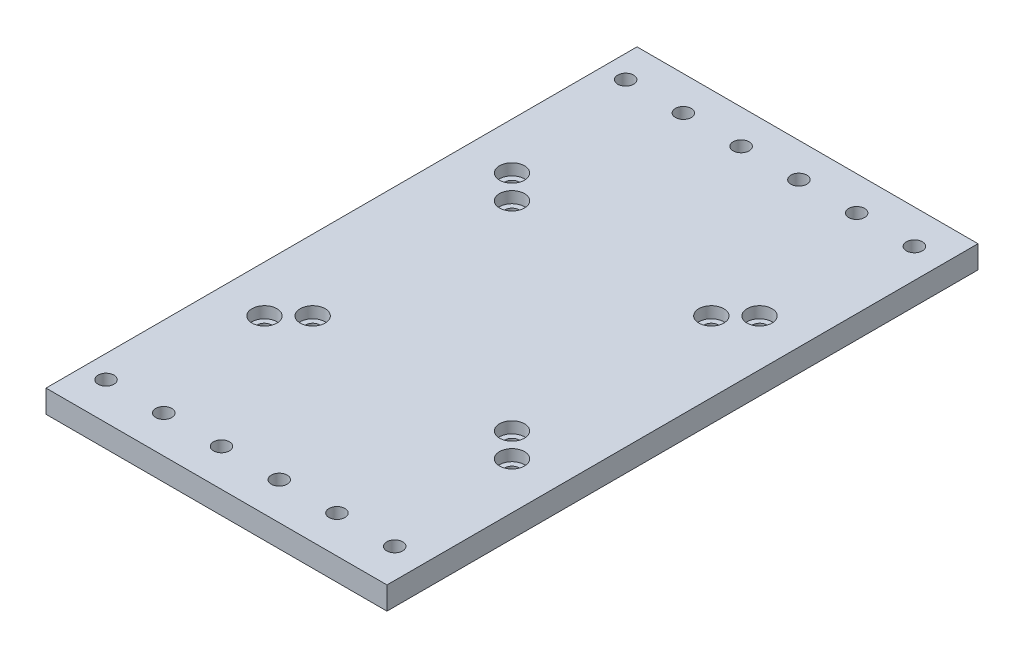
ISO-10303-21;
HEADER;
FILE_DESCRIPTION(('STEP AP214'),'2;1');
FILE_NAME('part.step','',(''),(''),'','','');
FILE_SCHEMA(('AUTOMOTIVE_DESIGN { 1 0 10303 214 1 1 1 1 }'));
ENDSEC;
DATA;
#1=APPLICATION_CONTEXT('core data for automotive mechanical design processes');
#2=APPLICATION_PROTOCOL_DEFINITION('international standard','automotive_design',2000,#1);
#3=PRODUCT_CONTEXT('',#1,'mechanical');
#4=PRODUCT('Part','Part','',(#3));
#5=PRODUCT_RELATED_PRODUCT_CATEGORY('part','',(#4));
#6=PRODUCT_DEFINITION_FORMATION('','',#4);
#7=PRODUCT_DEFINITION_CONTEXT('part definition',#1,'design');
#8=PRODUCT_DEFINITION('design','',#6,#7);
#9=PRODUCT_DEFINITION_SHAPE('','',#8);
#10=(LENGTH_UNIT() NAMED_UNIT(*) SI_UNIT(.MILLI.,.METRE.));
#11=(NAMED_UNIT(*) PLANE_ANGLE_UNIT() SI_UNIT($,.RADIAN.));
#12=(NAMED_UNIT(*) SI_UNIT($,.STERADIAN.) SOLID_ANGLE_UNIT());
#13=UNCERTAINTY_MEASURE_WITH_UNIT(LENGTH_MEASURE(1.E-05),#10,'distance_accuracy_value','');
#14=(GEOMETRIC_REPRESENTATION_CONTEXT(3) GLOBAL_UNCERTAINTY_ASSIGNED_CONTEXT((#13)) GLOBAL_UNIT_ASSIGNED_CONTEXT((#10,
#11,#12)) REPRESENTATION_CONTEXT('',''));
#15=CARTESIAN_POINT('',(0.,0.,0.));
#16=DIRECTION('',(0.,0.,1.));
#17=DIRECTION('',(1.,0.,0.));
#18=AXIS2_PLACEMENT_3D('',#15,#16,#17);
#19=CARTESIAN_POINT('',(-54.4472221513641,0.,54.4472221513643));
#20=DIRECTION('',(0.,1.,0.));
#21=DIRECTION('',(0.,0.,1.));
#22=AXIS2_PLACEMENT_3D('',#19,#20,#21);
#23=CYLINDRICAL_SURFACE('',#22,3.12499999999999);
#24=CARTESIAN_POINT('',(-54.4472221513641,0.,54.4472221513643));
#25=DIRECTION('',(0.,1.,0.));
#26=DIRECTION('',(0.,0.,1.));
#27=AXIS2_PLACEMENT_3D('',#24,#25,#26);
#28=CIRCLE('',#27,3.12499999999999);
#29=CARTESIAN_POINT('',(-54.4472221513641,0.,57.5722221513642));
#30=VERTEX_POINT('',#29);
#31=EDGE_CURVE('E103',#30,#30,#28,.T.);
#32=ORIENTED_EDGE('',*,*,#31,.F.);
#33=EDGE_LOOP('',(#32));
#34=FACE_BOUND('',#33,.T.);
#35=CARTESIAN_POINT('',(-54.4472221513641,5.,54.4472221513643));
#36=DIRECTION('',(0.,1.,0.));
#37=DIRECTION('',(0.,0.,1.));
#38=AXIS2_PLACEMENT_3D('',#35,#36,#37);
#39=CIRCLE('',#38,3.12499999999999);
#40=CARTESIAN_POINT('',(-54.4472221513641,5.,57.5722221513642));
#41=VERTEX_POINT('',#40);
#42=EDGE_CURVE('E131',#41,#41,#39,.F.);
#43=ORIENTED_EDGE('',*,*,#42,.F.);
#44=EDGE_LOOP('',(#43));
#45=FACE_BOUND('',#44,.T.);
#46=ADVANCED_FACE('F33',(#34,#45),#23,.F.);
#47=CARTESIAN_POINT('',(54.4472221513643,0.,54.447222151364));
#48=DIRECTION('',(0.,1.,0.));
#49=DIRECTION('',(0.,0.,1.));
#50=AXIS2_PLACEMENT_3D('',#47,#48,#49);
#51=CYLINDRICAL_SURFACE('',#50,3.125);
#52=CARTESIAN_POINT('',(54.4472221513643,0.,54.447222151364));
#53=DIRECTION('',(0.,1.,0.));
#54=DIRECTION('',(0.,0.,1.));
#55=AXIS2_PLACEMENT_3D('',#52,#53,#54);
#56=CIRCLE('',#55,3.125);
#57=CARTESIAN_POINT('',(54.4472221513643,0.,57.572222151364));
#58=VERTEX_POINT('',#57);
#59=EDGE_CURVE('E156',#58,#58,#56,.T.);
#60=ORIENTED_EDGE('',*,*,#59,.F.);
#61=EDGE_LOOP('',(#60));
#62=FACE_BOUND('',#61,.T.);
#63=CARTESIAN_POINT('',(54.4472221513643,5.,54.447222151364));
#64=DIRECTION('',(0.,1.,0.));
#65=DIRECTION('',(0.,0.,1.));
#66=AXIS2_PLACEMENT_3D('',#63,#64,#65);
#67=CIRCLE('',#66,3.125);
#68=CARTESIAN_POINT('',(54.4472221513643,5.,57.572222151364));
#69=VERTEX_POINT('',#68);
#70=EDGE_CURVE('E128',#69,#69,#67,.F.);
#71=ORIENTED_EDGE('',*,*,#70,.F.);
#72=EDGE_LOOP('',(#71));
#73=FACE_BOUND('',#72,.T.);
#74=ADVANCED_FACE('F189',(#62,#73),#51,.F.);
#75=CARTESIAN_POINT('',(43.840620433566,0.,43.8406204335658));
#76=DIRECTION('',(0.,1.,0.));
#77=DIRECTION('',(0.,0.,1.));
#78=AXIS2_PLACEMENT_3D('',#75,#76,#77);
#79=CYLINDRICAL_SURFACE('',#78,3.125);
#80=CARTESIAN_POINT('',(43.840620433566,0.,43.8406204335658));
#81=DIRECTION('',(0.,1.,0.));
#82=DIRECTION('',(0.,0.,1.));
#83=AXIS2_PLACEMENT_3D('',#80,#81,#82);
#84=CIRCLE('',#83,3.125);
#85=CARTESIAN_POINT('',(43.840620433566,0.,46.9656204335658));
#86=VERTEX_POINT('',#85);
#87=EDGE_CURVE('E160',#86,#86,#84,.T.);
#88=ORIENTED_EDGE('',*,*,#87,.F.);
#89=EDGE_LOOP('',(#88));
#90=FACE_BOUND('',#89,.T.);
#91=CARTESIAN_POINT('',(43.840620433566,5.,43.8406204335658));
#92=DIRECTION('',(0.,1.,0.));
#93=DIRECTION('',(0.,0.,1.));
#94=AXIS2_PLACEMENT_3D('',#91,#92,#93);
#95=CIRCLE('',#94,3.125);
#96=CARTESIAN_POINT('',(43.840620433566,5.,46.9656204335658));
#97=VERTEX_POINT('',#96);
#98=EDGE_CURVE('E125',#97,#97,#95,.F.);
#99=ORIENTED_EDGE('',*,*,#98,.F.);
#100=EDGE_LOOP('',(#99));
#101=FACE_BOUND('',#100,.T.);
#102=ADVANCED_FACE('F238',(#90,#101),#79,.F.);
#103=CARTESIAN_POINT('',(54.447222151364,0.,-54.4472221513643));
#104=DIRECTION('',(0.,1.,0.));
#105=DIRECTION('',(0.,0.,1.));
#106=AXIS2_PLACEMENT_3D('',#103,#104,#105);
#107=CYLINDRICAL_SURFACE('',#106,3.12500000000002);
#108=CARTESIAN_POINT('',(54.447222151364,0.,-54.4472221513643));
#109=DIRECTION('',(0.,1.,0.));
#110=DIRECTION('',(0.,0.,1.));
#111=AXIS2_PLACEMENT_3D('',#108,#109,#110);
#112=CIRCLE('',#111,3.12500000000002);
#113=CARTESIAN_POINT('',(54.447222151364,0.,-51.3222221513642));
#114=VERTEX_POINT('',#113);
#115=EDGE_CURVE('E165',#114,#114,#112,.T.);
#116=ORIENTED_EDGE('',*,*,#115,.F.);
#117=EDGE_LOOP('',(#116));
#118=FACE_BOUND('',#117,.T.);
#119=CARTESIAN_POINT('',(54.447222151364,5.,-54.4472221513643));
#120=DIRECTION('',(0.,1.,0.));
#121=DIRECTION('',(0.,0.,1.));
#122=AXIS2_PLACEMENT_3D('',#119,#120,#121);
#123=CIRCLE('',#122,3.12500000000002);
#124=CARTESIAN_POINT('',(54.447222151364,5.,-51.3222221513642));
#125=VERTEX_POINT('',#124);
#126=EDGE_CURVE('E122',#125,#125,#123,.F.);
#127=ORIENTED_EDGE('',*,*,#126,.F.);
#128=EDGE_LOOP('',(#127));
#129=FACE_BOUND('',#128,.T.);
#130=ADVANCED_FACE('F234',(#118,#129),#107,.F.);
#131=CARTESIAN_POINT('',(-43.8406204335659,0.,43.840620433566));
#132=DIRECTION('',(0.,1.,0.));
#133=DIRECTION('',(0.,0.,1.));
#134=AXIS2_PLACEMENT_3D('',#131,#132,#133);
#135=CYLINDRICAL_SURFACE('',#134,3.125);
#136=CARTESIAN_POINT('',(-43.8406204335659,0.,43.840620433566));
#137=DIRECTION('',(0.,1.,0.));
#138=DIRECTION('',(0.,0.,1.));
#139=AXIS2_PLACEMENT_3D('',#136,#137,#138);
#140=CIRCLE('',#139,3.125);
#141=CARTESIAN_POINT('',(-43.8406204335659,0.,46.965620433566));
#142=VERTEX_POINT('',#141);
#143=EDGE_CURVE('E176',#142,#142,#140,.T.);
#144=ORIENTED_EDGE('',*,*,#143,.F.);
#145=EDGE_LOOP('',(#144));
#146=FACE_BOUND('',#145,.T.);
#147=CARTESIAN_POINT('',(-43.8406204335659,5.,43.840620433566));
#148=DIRECTION('',(0.,1.,0.));
#149=DIRECTION('',(0.,0.,1.));
#150=AXIS2_PLACEMENT_3D('',#147,#148,#149);
#151=CIRCLE('',#150,3.125);
#152=CARTESIAN_POINT('',(-43.8406204335659,5.,46.965620433566));
#153=VERTEX_POINT('',#152);
#154=EDGE_CURVE('E119',#153,#153,#151,.F.);
#155=ORIENTED_EDGE('',*,*,#154,.F.);
#156=EDGE_LOOP('',(#155));
#157=FACE_BOUND('',#156,.T.);
#158=ADVANCED_FACE('F237',(#146,#157),#135,.F.);
#159=CARTESIAN_POINT('',(-54.4472221513643,0.,-54.447222151364));
#160=DIRECTION('',(0.,1.,0.));
#161=DIRECTION('',(0.,0.,1.));
#162=AXIS2_PLACEMENT_3D('',#159,#160,#161);
#163=CYLINDRICAL_SURFACE('',#162,3.125);
#164=CARTESIAN_POINT('',(-54.4472221513643,0.,-54.447222151364));
#165=DIRECTION('',(0.,1.,0.));
#166=DIRECTION('',(0.,0.,1.));
#167=AXIS2_PLACEMENT_3D('',#164,#165,#166);
#168=CIRCLE('',#167,3.125);
#169=CARTESIAN_POINT('',(-54.4472221513643,0.,-51.322222151364));
#170=VERTEX_POINT('',#169);
#171=EDGE_CURVE('E172',#170,#170,#168,.T.);
#172=ORIENTED_EDGE('',*,*,#171,.F.);
#173=EDGE_LOOP('',(#172));
#174=FACE_BOUND('',#173,.T.);
#175=CARTESIAN_POINT('',(-54.4472221513643,5.,-54.447222151364));
#176=DIRECTION('',(0.,1.,0.));
#177=DIRECTION('',(0.,0.,1.));
#178=AXIS2_PLACEMENT_3D('',#175,#176,#177);
#179=CIRCLE('',#178,3.125);
#180=CARTESIAN_POINT('',(-54.4472221513643,5.,-51.322222151364));
#181=VERTEX_POINT('',#180);
#182=EDGE_CURVE('E116',#181,#181,#179,.F.);
#183=ORIENTED_EDGE('',*,*,#182,.F.);
#184=EDGE_LOOP('',(#183));
#185=FACE_BOUND('',#184,.T.);
#186=ADVANCED_FACE('F250',(#174,#185),#163,.F.);
#187=CARTESIAN_POINT('',(-43.840620433566,0.,-43.8406204335659));
#188=DIRECTION('',(0.,1.,0.));
#189=DIRECTION('',(0.,0.,1.));
#190=AXIS2_PLACEMENT_3D('',#187,#188,#189);
#191=CYLINDRICAL_SURFACE('',#190,3.125);
#192=CARTESIAN_POINT('',(-43.840620433566,0.,-43.8406204335659));
#193=DIRECTION('',(0.,1.,0.));
#194=DIRECTION('',(0.,0.,1.));
#195=AXIS2_PLACEMENT_3D('',#192,#193,#194);
#196=CIRCLE('',#195,3.125);
#197=CARTESIAN_POINT('',(-43.840620433566,0.,-40.7156204335659));
#198=VERTEX_POINT('',#197);
#199=EDGE_CURVE('E169',#198,#198,#196,.T.);
#200=ORIENTED_EDGE('',*,*,#199,.F.);
#201=EDGE_LOOP('',(#200));
#202=FACE_BOUND('',#201,.T.);
#203=CARTESIAN_POINT('',(-43.840620433566,5.,-43.8406204335659));
#204=DIRECTION('',(0.,1.,0.));
#205=DIRECTION('',(0.,0.,1.));
#206=AXIS2_PLACEMENT_3D('',#203,#204,#205);
#207=CIRCLE('',#206,3.125);
#208=CARTESIAN_POINT('',(-43.840620433566,5.,-40.7156204335659));
#209=VERTEX_POINT('',#208);
#210=EDGE_CURVE('E112',#209,#209,#207,.F.);
#211=ORIENTED_EDGE('',*,*,#210,.F.);
#212=EDGE_LOOP('',(#211));
#213=FACE_BOUND('',#212,.T.);
#214=ADVANCED_FACE('F246',(#202,#213),#191,.F.);
#215=CARTESIAN_POINT('',(43.8406204335659,0.,-43.840620433566));
#216=DIRECTION('',(0.,1.,0.));
#217=DIRECTION('',(0.,0.,1.));
#218=AXIS2_PLACEMENT_3D('',#215,#216,#217);
#219=CYLINDRICAL_SURFACE('',#218,3.125);
#220=CARTESIAN_POINT('',(43.8406204335659,0.,-43.840620433566));
#221=DIRECTION('',(0.,1.,0.));
#222=DIRECTION('',(0.,0.,1.));
#223=AXIS2_PLACEMENT_3D('',#220,#221,#222);
#224=CIRCLE('',#223,3.125);
#225=CARTESIAN_POINT('',(43.8406204335659,0.,-40.715620433566));
#226=VERTEX_POINT('',#225);
#227=EDGE_CURVE('E173',#226,#226,#224,.T.);
#228=ORIENTED_EDGE('',*,*,#227,.F.);
#229=EDGE_LOOP('',(#228));
#230=FACE_BOUND('',#229,.T.);
#231=CARTESIAN_POINT('',(43.8406204335659,5.,-43.840620433566));
#232=DIRECTION('',(0.,1.,0.));
#233=DIRECTION('',(0.,0.,1.));
#234=AXIS2_PLACEMENT_3D('',#231,#232,#233);
#235=CIRCLE('',#234,3.125);
#236=CARTESIAN_POINT('',(43.8406204335659,5.,-40.715620433566));
#237=VERTEX_POINT('',#236);
#238=EDGE_CURVE('E109',#237,#237,#235,.F.);
#239=ORIENTED_EDGE('',*,*,#238,.F.);
#240=EDGE_LOOP('',(#239));
#241=FACE_BOUND('',#240,.T.);
#242=ADVANCED_FACE('F249',(#230,#241),#219,.F.);
#243=CARTESIAN_POINT('',(75.,10.,130.));
#244=DIRECTION('',(-1.,0.,0.));
#245=DIRECTION('',(0.,0.,1.));
#246=AXIS2_PLACEMENT_3D('',#243,#244,#245);
#247=PLANE('',#246);
#248=DIRECTION('',(0.,0.,-1.));
#249=VECTOR('',#248,1.);
#250=CARTESIAN_POINT('',(75.,0.,130.));
#251=LINE('',#250,#249);
#252=CARTESIAN_POINT('',(75.,0.,130.));
#253=VERTEX_POINT('',#252);
#254=CARTESIAN_POINT('',(75.,0.,-130.));
#255=VERTEX_POINT('',#254);
#256=EDGE_CURVE('E100',#253,#255,#251,.T.);
#257=ORIENTED_EDGE('',*,*,#256,.T.);
#258=DIRECTION('',(0.,-1.,0.));
#259=VECTOR('',#258,1.);
#260=CARTESIAN_POINT('',(75.,10.,-130.));
#261=LINE('',#260,#259);
#262=CARTESIAN_POINT('',(75.,10.,-130.));
#263=VERTEX_POINT('',#262);
#264=EDGE_CURVE('E11',#263,#255,#261,.T.);
#265=ORIENTED_EDGE('',*,*,#264,.F.);
#266=DIRECTION('',(0.,0.,-1.));
#267=VECTOR('',#266,1.);
#268=CARTESIAN_POINT('',(75.,10.,130.));
#269=LINE('',#268,#267);
#270=CARTESIAN_POINT('',(75.,10.,130.));
#271=VERTEX_POINT('',#270);
#272=EDGE_CURVE('E87',#271,#263,#269,.T.);
#273=ORIENTED_EDGE('',*,*,#272,.F.);
#274=DIRECTION('',(0.,-1.,0.));
#275=VECTOR('',#274,1.);
#276=CARTESIAN_POINT('',(75.,10.,130.));
#277=LINE('',#276,#275);
#278=EDGE_CURVE('E96',#271,#253,#277,.T.);
#279=ORIENTED_EDGE('',*,*,#278,.T.);
#280=EDGE_LOOP('',(#257,#265,#273,#279));
#281=FACE_BOUND('',#280,.T.);
#282=ADVANCED_FACE('F35',(#281),#247,.F.);
#283=CARTESIAN_POINT('',(-75.,10.,-130.));
#284=DIRECTION('',(0.,0.,1.));
#285=DIRECTION('',(1.,0.,0.));
#286=AXIS2_PLACEMENT_3D('',#283,#284,#285);
#287=PLANE('',#286);
#288=DIRECTION('',(-1.,0.,0.));
#289=VECTOR('',#288,1.);
#290=CARTESIAN_POINT('',(-75.,0.,-130.));
#291=LINE('',#290,#289);
#292=CARTESIAN_POINT('',(-75.,0.,-130.));
#293=VERTEX_POINT('',#292);
#294=EDGE_CURVE('E91',#255,#293,#291,.T.);
#295=ORIENTED_EDGE('',*,*,#294,.T.);
#296=DIRECTION('',(0.,-1.,0.));
#297=VECTOR('',#296,1.);
#298=CARTESIAN_POINT('',(-75.,10.,-130.));
#299=LINE('',#298,#297);
#300=CARTESIAN_POINT('',(-75.,10.,-130.));
#301=VERTEX_POINT('',#300);
#302=EDGE_CURVE('E43',#301,#293,#299,.T.);
#303=ORIENTED_EDGE('',*,*,#302,.F.);
#304=DIRECTION('',(-1.,0.,0.));
#305=VECTOR('',#304,1.);
#306=CARTESIAN_POINT('',(-75.,10.,-130.));
#307=LINE('',#306,#305);
#308=EDGE_CURVE('E82',#263,#301,#307,.T.);
#309=ORIENTED_EDGE('',*,*,#308,.F.);
#310=ORIENTED_EDGE('',*,*,#264,.T.);
#311=EDGE_LOOP('',(#295,#303,#309,#310));
#312=FACE_BOUND('',#311,.T.);
#313=ADVANCED_FACE('F90',(#312),#287,.F.);
#314=CARTESIAN_POINT('',(-75.,10.,130.));
#315=DIRECTION('',(1.,0.,0.));
#316=DIRECTION('',(0.,0.,-1.));
#317=AXIS2_PLACEMENT_3D('',#314,#315,#316);
#318=PLANE('',#317);
#319=DIRECTION('',(0.,0.,1.));
#320=VECTOR('',#319,1.);
#321=CARTESIAN_POINT('',(-75.,0.,130.));
#322=LINE('',#321,#320);
#323=CARTESIAN_POINT('',(-75.,0.,130.));
#324=VERTEX_POINT('',#323);
#325=EDGE_CURVE('E69',#293,#324,#322,.T.);
#326=ORIENTED_EDGE('',*,*,#325,.T.);
#327=DIRECTION('',(0.,-1.,0.));
#328=VECTOR('',#327,1.);
#329=CARTESIAN_POINT('',(-75.,10.,130.));
#330=LINE('',#329,#328);
#331=CARTESIAN_POINT('',(-75.,10.,130.));
#332=VERTEX_POINT('',#331);
#333=EDGE_CURVE('E92',#332,#324,#330,.T.);
#334=ORIENTED_EDGE('',*,*,#333,.F.);
#335=DIRECTION('',(0.,0.,1.));
#336=VECTOR('',#335,1.);
#337=CARTESIAN_POINT('',(-75.,10.,130.));
#338=LINE('',#337,#336);
#339=EDGE_CURVE('E85',#301,#332,#338,.T.);
#340=ORIENTED_EDGE('',*,*,#339,.F.);
#341=ORIENTED_EDGE('',*,*,#302,.T.);
#342=EDGE_LOOP('',(#326,#334,#340,#341));
#343=FACE_BOUND('',#342,.T.);
#344=ADVANCED_FACE('F94',(#343),#318,.F.);
#345=CARTESIAN_POINT('',(-75.,10.,130.));
#346=DIRECTION('',(0.,0.,-1.));
#347=DIRECTION('',(-1.,0.,0.));
#348=AXIS2_PLACEMENT_3D('',#345,#346,#347);
#349=PLANE('',#348);
#350=DIRECTION('',(1.,0.,0.));
#351=VECTOR('',#350,1.);
#352=CARTESIAN_POINT('',(-75.,0.,130.));
#353=LINE('',#352,#351);
#354=EDGE_CURVE('E75',#324,#253,#353,.T.);
#355=ORIENTED_EDGE('',*,*,#354,.T.);
#356=ORIENTED_EDGE('',*,*,#278,.F.);
#357=DIRECTION('',(1.,0.,0.));
#358=VECTOR('',#357,1.);
#359=CARTESIAN_POINT('',(-75.,10.,130.));
#360=LINE('',#359,#358);
#361=EDGE_CURVE('E52',#332,#271,#360,.T.);
#362=ORIENTED_EDGE('',*,*,#361,.F.);
#363=ORIENTED_EDGE('',*,*,#333,.T.);
#364=EDGE_LOOP('',(#355,#356,#362,#363));
#365=FACE_BOUND('',#364,.T.);
#366=ADVANCED_FACE('F263',(#365),#349,.F.);
#367=CARTESIAN_POINT('',(0.,10.,0.));
#368=DIRECTION('',(0.,-1.,0.));
#369=DIRECTION('',(0.,0.,-1.));
#370=AXIS2_PLACEMENT_3D('',#367,#368,#369);
#371=PLANE('',#370);
#372=CARTESIAN_POINT('',(-14.2,10.,113.6));
#373=DIRECTION('',(0.,1.,0.));
#374=DIRECTION('',(0.,0.,1.));
#375=AXIS2_PLACEMENT_3D('',#372,#373,#374);
#376=CIRCLE('',#375,3.50000000000001);
#377=CARTESIAN_POINT('',(-14.2,10.,117.1));
#378=VERTEX_POINT('',#377);
#379=EDGE_CURVE('E594',#378,#378,#376,.T.);
#380=ORIENTED_EDGE('',*,*,#379,.F.);
#381=EDGE_LOOP('',(#380));
#382=FACE_BOUND('',#381,.T.);
#383=CARTESIAN_POINT('',(-39.6,10.,113.6));
#384=DIRECTION('',(0.,1.,0.));
#385=DIRECTION('',(0.,0.,1.));
#386=AXIS2_PLACEMENT_3D('',#383,#384,#385);
#387=CIRCLE('',#386,3.5);
#388=CARTESIAN_POINT('',(-39.6,10.,117.1));
#389=VERTEX_POINT('',#388);
#390=EDGE_CURVE('E597',#389,#389,#387,.T.);
#391=ORIENTED_EDGE('',*,*,#390,.F.);
#392=EDGE_LOOP('',(#391));
#393=FACE_BOUND('',#392,.T.);
#394=CARTESIAN_POINT('',(62.,10.,-115.));
#395=DIRECTION('',(0.,1.,0.));
#396=DIRECTION('',(0.,0.,1.));
#397=AXIS2_PLACEMENT_3D('',#394,#395,#396);
#398=CIRCLE('',#397,3.49999999999999);
#399=CARTESIAN_POINT('',(62.,10.,-111.5));
#400=VERTEX_POINT('',#399);
#401=EDGE_CURVE('E739',#400,#400,#398,.T.);
#402=ORIENTED_EDGE('',*,*,#401,.F.);
#403=EDGE_LOOP('',(#402));
#404=FACE_BOUND('',#403,.T.);
#405=CARTESIAN_POINT('',(36.6,10.,-115.));
#406=DIRECTION('',(0.,1.,0.));
#407=DIRECTION('',(0.,0.,1.));
#408=AXIS2_PLACEMENT_3D('',#405,#406,#407);
#409=CIRCLE('',#408,3.5);
#410=CARTESIAN_POINT('',(36.6,10.,-111.5));
#411=VERTEX_POINT('',#410);
#412=EDGE_CURVE('E726',#411,#411,#409,.T.);
#413=ORIENTED_EDGE('',*,*,#412,.F.);
#414=EDGE_LOOP('',(#413));
#415=FACE_BOUND('',#414,.T.);
#416=CARTESIAN_POINT('',(11.2,10.,-115.));
#417=DIRECTION('',(0.,1.,0.));
#418=DIRECTION('',(0.,0.,1.));
#419=AXIS2_PLACEMENT_3D('',#416,#417,#418);
#420=CIRCLE('',#419,3.5);
#421=CARTESIAN_POINT('',(11.2,10.,-111.5));
#422=VERTEX_POINT('',#421);
#423=EDGE_CURVE('E626',#422,#422,#420,.T.);
#424=ORIENTED_EDGE('',*,*,#423,.F.);
#425=EDGE_LOOP('',(#424));
#426=FACE_BOUND('',#425,.T.);
#427=CARTESIAN_POINT('',(-14.2,10.,-115.));
#428=DIRECTION('',(0.,1.,0.));
#429=DIRECTION('',(0.,0.,1.));
#430=AXIS2_PLACEMENT_3D('',#427,#428,#429);
#431=CIRCLE('',#430,3.5);
#432=CARTESIAN_POINT('',(-14.2,10.,-111.5));
#433=VERTEX_POINT('',#432);
#434=EDGE_CURVE('E620',#433,#433,#431,.T.);
#435=ORIENTED_EDGE('',*,*,#434,.F.);
#436=EDGE_LOOP('',(#435));
#437=FACE_BOUND('',#436,.T.);
#438=CARTESIAN_POINT('',(-39.6,10.,-115.));
#439=DIRECTION('',(0.,1.,0.));
#440=DIRECTION('',(0.,0.,1.));
#441=AXIS2_PLACEMENT_3D('',#438,#439,#440);
#442=CIRCLE('',#441,3.5);
#443=CARTESIAN_POINT('',(-39.6,10.,-111.5));
#444=VERTEX_POINT('',#443);
#445=EDGE_CURVE('E614',#444,#444,#442,.T.);
#446=ORIENTED_EDGE('',*,*,#445,.F.);
#447=EDGE_LOOP('',(#446));
#448=FACE_BOUND('',#447,.T.);
#449=CARTESIAN_POINT('',(-65.,10.,113.6));
#450=DIRECTION('',(0.,1.,0.));
#451=DIRECTION('',(0.,0.,1.));
#452=AXIS2_PLACEMENT_3D('',#449,#450,#451);
#453=CIRCLE('',#452,3.5);
#454=CARTESIAN_POINT('',(-65.,10.,117.1));
#455=VERTEX_POINT('',#454);
#456=EDGE_CURVE('E608',#455,#455,#453,.T.);
#457=ORIENTED_EDGE('',*,*,#456,.F.);
#458=EDGE_LOOP('',(#457));
#459=FACE_BOUND('',#458,.T.);
#460=CARTESIAN_POINT('',(11.2,10.,113.6));
#461=DIRECTION('',(0.,1.,0.));
#462=DIRECTION('',(0.,0.,1.));
#463=AXIS2_PLACEMENT_3D('',#460,#461,#462);
#464=CIRCLE('',#463,3.50000000000001);
#465=CARTESIAN_POINT('',(11.2,10.,117.1));
#466=VERTEX_POINT('',#465);
#467=EDGE_CURVE('E600',#466,#466,#464,.T.);
#468=ORIENTED_EDGE('',*,*,#467,.F.);
#469=EDGE_LOOP('',(#468));
#470=FACE_BOUND('',#469,.T.);
#471=CARTESIAN_POINT('',(36.6,10.,113.6));
#472=DIRECTION('',(0.,1.,0.));
#473=DIRECTION('',(0.,0.,1.));
#474=AXIS2_PLACEMENT_3D('',#471,#472,#473);
#475=CIRCLE('',#474,3.5);
#476=CARTESIAN_POINT('',(36.6,10.,117.1));
#477=VERTEX_POINT('',#476);
#478=EDGE_CURVE('E766',#477,#477,#475,.T.);
#479=ORIENTED_EDGE('',*,*,#478,.F.);
#480=EDGE_LOOP('',(#479));
#481=FACE_BOUND('',#480,.T.);
#482=CARTESIAN_POINT('',(62.,10.,113.6));
#483=DIRECTION('',(0.,1.,0.));
#484=DIRECTION('',(0.,0.,1.));
#485=AXIS2_PLACEMENT_3D('',#482,#483,#484);
#486=CIRCLE('',#485,3.49999999999999);
#487=CARTESIAN_POINT('',(62.,10.,117.1));
#488=VERTEX_POINT('',#487);
#489=EDGE_CURVE('E734',#488,#488,#486,.T.);
#490=ORIENTED_EDGE('',*,*,#489,.F.);
#491=EDGE_LOOP('',(#490));
#492=FACE_BOUND('',#491,.T.);
#493=CARTESIAN_POINT('',(-65.,10.,-115.));
#494=DIRECTION('',(0.,1.,0.));
#495=DIRECTION('',(0.,0.,1.));
#496=AXIS2_PLACEMENT_3D('',#493,#494,#495);
#497=CIRCLE('',#496,3.5);
#498=CARTESIAN_POINT('',(-65.,10.,-111.5));
#499=VERTEX_POINT('',#498);
#500=EDGE_CURVE('E607',#499,#499,#497,.T.);
#501=ORIENTED_EDGE('',*,*,#500,.F.);
#502=EDGE_LOOP('',(#501));
#503=FACE_BOUND('',#502,.T.);
#504=CARTESIAN_POINT('',(43.8406204335659,10.,-43.840620433566));
#505=DIRECTION('',(0.,-1.,0.));
#506=DIRECTION('',(0.,0.,-1.));
#507=AXIS2_PLACEMENT_3D('',#504,#505,#506);
#508=CIRCLE('',#507,5.5);
#509=CARTESIAN_POINT('',(43.8406204335659,10.,-49.340620433566));
#510=VERTEX_POINT('',#509);
#511=EDGE_CURVE('E37',#510,#510,#508,.T.);
#512=ORIENTED_EDGE('',*,*,#511,.T.);
#513=EDGE_LOOP('',(#512));
#514=FACE_BOUND('',#513,.T.);
#515=CARTESIAN_POINT('',(54.4472221513643,10.,54.447222151364));
#516=DIRECTION('',(0.,-1.,0.));
#517=DIRECTION('',(0.,0.,-1.));
#518=AXIS2_PLACEMENT_3D('',#515,#516,#517);
#519=CIRCLE('',#518,5.5);
#520=CARTESIAN_POINT('',(54.4472221513643,10.,48.947222151364));
#521=VERTEX_POINT('',#520);
#522=EDGE_CURVE('E151',#521,#521,#519,.T.);
#523=ORIENTED_EDGE('',*,*,#522,.T.);
#524=EDGE_LOOP('',(#523));
#525=FACE_BOUND('',#524,.T.);
#526=CARTESIAN_POINT('',(43.840620433566,10.,43.8406204335658));
#527=DIRECTION('',(0.,-1.,0.));
#528=DIRECTION('',(0.,0.,-1.));
#529=AXIS2_PLACEMENT_3D('',#526,#527,#528);
#530=CIRCLE('',#529,5.5);
#531=CARTESIAN_POINT('',(43.840620433566,10.,38.3406204335658));
#532=VERTEX_POINT('',#531);
#533=EDGE_CURVE('E149',#532,#532,#530,.T.);
#534=ORIENTED_EDGE('',*,*,#533,.T.);
#535=EDGE_LOOP('',(#534));
#536=FACE_BOUND('',#535,.T.);
#537=CARTESIAN_POINT('',(-54.4472221513641,10.,54.4472221513643));
#538=DIRECTION('',(0.,-1.,0.));
#539=DIRECTION('',(0.,0.,-1.));
#540=AXIS2_PLACEMENT_3D('',#537,#538,#539);
#541=CIRCLE('',#540,5.5);
#542=CARTESIAN_POINT('',(-54.4472221513641,10.,48.9472221513643));
#543=VERTEX_POINT('',#542);
#544=EDGE_CURVE('E146',#543,#543,#541,.T.);
#545=ORIENTED_EDGE('',*,*,#544,.T.);
#546=EDGE_LOOP('',(#545));
#547=FACE_BOUND('',#546,.T.);
#548=CARTESIAN_POINT('',(-54.4472221513643,10.,-54.447222151364));
#549=DIRECTION('',(0.,-1.,0.));
#550=DIRECTION('',(0.,0.,-1.));
#551=AXIS2_PLACEMENT_3D('',#548,#549,#550);
#552=CIRCLE('',#551,5.5);
#553=CARTESIAN_POINT('',(-54.4472221513643,10.,-59.947222151364));
#554=VERTEX_POINT('',#553);
#555=EDGE_CURVE('E143',#554,#554,#552,.T.);
#556=ORIENTED_EDGE('',*,*,#555,.T.);
#557=EDGE_LOOP('',(#556));
#558=FACE_BOUND('',#557,.T.);
#559=CARTESIAN_POINT('',(-43.840620433566,10.,-43.8406204335659));
#560=DIRECTION('',(0.,-1.,0.));
#561=DIRECTION('',(0.,0.,-1.));
#562=AXIS2_PLACEMENT_3D('',#559,#560,#561);
#563=CIRCLE('',#562,5.5);
#564=CARTESIAN_POINT('',(-43.840620433566,10.,-49.3406204335659));
#565=VERTEX_POINT('',#564);
#566=EDGE_CURVE('E140',#565,#565,#563,.T.);
#567=ORIENTED_EDGE('',*,*,#566,.T.);
#568=EDGE_LOOP('',(#567));
#569=FACE_BOUND('',#568,.T.);
#570=CARTESIAN_POINT('',(54.447222151364,10.,-54.4472221513643));
#571=DIRECTION('',(0.,-1.,0.));
#572=DIRECTION('',(0.,0.,-1.));
#573=AXIS2_PLACEMENT_3D('',#570,#571,#572);
#574=CIRCLE('',#573,5.5);
#575=CARTESIAN_POINT('',(54.447222151364,10.,-59.9472221513643));
#576=VERTEX_POINT('',#575);
#577=EDGE_CURVE('E137',#576,#576,#574,.T.);
#578=ORIENTED_EDGE('',*,*,#577,.T.);
#579=EDGE_LOOP('',(#578));
#580=FACE_BOUND('',#579,.T.);
#581=CARTESIAN_POINT('',(-43.8406204335659,10.,43.840620433566));
#582=DIRECTION('',(0.,-1.,0.));
#583=DIRECTION('',(0.,0.,-1.));
#584=AXIS2_PLACEMENT_3D('',#581,#582,#583);
#585=CIRCLE('',#584,5.5);
#586=CARTESIAN_POINT('',(-43.8406204335659,10.,38.340620433566));
#587=VERTEX_POINT('',#586);
#588=EDGE_CURVE('E134',#587,#587,#585,.T.);
#589=ORIENTED_EDGE('',*,*,#588,.T.);
#590=EDGE_LOOP('',(#589));
#591=FACE_BOUND('',#590,.T.);
#592=ORIENTED_EDGE('',*,*,#272,.T.);
#593=ORIENTED_EDGE('',*,*,#308,.T.);
#594=ORIENTED_EDGE('',*,*,#339,.T.);
#595=ORIENTED_EDGE('',*,*,#361,.T.);
#596=EDGE_LOOP('',(#592,#593,#594,#595));
#597=FACE_BOUND('',#596,.T.);
#598=ADVANCED_FACE('F83',(#382,#393,#404,#415,#426,#437,#448,#459,#470,#481,#492,#503,#514,#525,
#536,#547,#558,#569,#580,#591,#597),#371,.F.);
#599=CARTESIAN_POINT('',(0.,0.,0.));
#600=DIRECTION('',(0.,-1.,0.));
#601=DIRECTION('',(0.,0.,-1.));
#602=AXIS2_PLACEMENT_3D('',#599,#600,#601);
#603=PLANE('',#602);
#604=CARTESIAN_POINT('',(-14.2,0.,113.6));
#605=DIRECTION('',(0.,1.,0.));
#606=DIRECTION('',(0.,0.,1.));
#607=AXIS2_PLACEMENT_3D('',#604,#605,#606);
#608=CIRCLE('',#607,3.50000000000001);
#609=CARTESIAN_POINT('',(-14.2,0.,117.1));
#610=VERTEX_POINT('',#609);
#611=EDGE_CURVE('E591',#610,#610,#608,.T.);
#612=ORIENTED_EDGE('',*,*,#611,.T.);
#613=EDGE_LOOP('',(#612));
#614=FACE_BOUND('',#613,.T.);
#615=CARTESIAN_POINT('',(-39.6,0.,113.6));
#616=DIRECTION('',(0.,1.,0.));
#617=DIRECTION('',(0.,0.,1.));
#618=AXIS2_PLACEMENT_3D('',#615,#616,#617);
#619=CIRCLE('',#618,3.5);
#620=CARTESIAN_POINT('',(-39.6,0.,117.1));
#621=VERTEX_POINT('',#620);
#622=EDGE_CURVE('E742',#621,#621,#619,.T.);
#623=ORIENTED_EDGE('',*,*,#622,.T.);
#624=EDGE_LOOP('',(#623));
#625=FACE_BOUND('',#624,.T.);
#626=CARTESIAN_POINT('',(62.,0.,-115.));
#627=DIRECTION('',(0.,1.,0.));
#628=DIRECTION('',(0.,0.,1.));
#629=AXIS2_PLACEMENT_3D('',#626,#627,#628);
#630=CIRCLE('',#629,3.49999999999999);
#631=CARTESIAN_POINT('',(62.,0.,-111.5));
#632=VERTEX_POINT('',#631);
#633=EDGE_CURVE('E731',#632,#632,#630,.T.);
#634=ORIENTED_EDGE('',*,*,#633,.T.);
#635=EDGE_LOOP('',(#634));
#636=FACE_BOUND('',#635,.T.);
#637=CARTESIAN_POINT('',(36.6,0.,-115.));
#638=DIRECTION('',(0.,1.,0.));
#639=DIRECTION('',(0.,0.,1.));
#640=AXIS2_PLACEMENT_3D('',#637,#638,#639);
#641=CIRCLE('',#640,3.5);
#642=CARTESIAN_POINT('',(36.6,0.,-111.5));
#643=VERTEX_POINT('',#642);
#644=EDGE_CURVE('E629',#643,#643,#641,.T.);
#645=ORIENTED_EDGE('',*,*,#644,.T.);
#646=EDGE_LOOP('',(#645));
#647=FACE_BOUND('',#646,.T.);
#648=CARTESIAN_POINT('',(11.2,0.,-115.));
#649=DIRECTION('',(0.,1.,0.));
#650=DIRECTION('',(0.,0.,1.));
#651=AXIS2_PLACEMENT_3D('',#648,#649,#650);
#652=CIRCLE('',#651,3.5);
#653=CARTESIAN_POINT('',(11.2,0.,-111.5));
#654=VERTEX_POINT('',#653);
#655=EDGE_CURVE('E623',#654,#654,#652,.T.);
#656=ORIENTED_EDGE('',*,*,#655,.T.);
#657=EDGE_LOOP('',(#656));
#658=FACE_BOUND('',#657,.T.);
#659=CARTESIAN_POINT('',(-14.2,0.,-115.));
#660=DIRECTION('',(0.,1.,0.));
#661=DIRECTION('',(0.,0.,1.));
#662=AXIS2_PLACEMENT_3D('',#659,#660,#661);
#663=CIRCLE('',#662,3.5);
#664=CARTESIAN_POINT('',(-14.2,0.,-111.5));
#665=VERTEX_POINT('',#664);
#666=EDGE_CURVE('E617',#665,#665,#663,.T.);
#667=ORIENTED_EDGE('',*,*,#666,.T.);
#668=EDGE_LOOP('',(#667));
#669=FACE_BOUND('',#668,.T.);
#670=CARTESIAN_POINT('',(-39.6,0.,-115.));
#671=DIRECTION('',(0.,1.,0.));
#672=DIRECTION('',(0.,0.,1.));
#673=AXIS2_PLACEMENT_3D('',#670,#671,#672);
#674=CIRCLE('',#673,3.5);
#675=CARTESIAN_POINT('',(-39.6,0.,-111.5));
#676=VERTEX_POINT('',#675);
#677=EDGE_CURVE('E611',#676,#676,#674,.T.);
#678=ORIENTED_EDGE('',*,*,#677,.T.);
#679=EDGE_LOOP('',(#678));
#680=FACE_BOUND('',#679,.T.);
#681=CARTESIAN_POINT('',(-65.,0.,113.6));
#682=DIRECTION('',(0.,1.,0.));
#683=DIRECTION('',(0.,0.,1.));
#684=AXIS2_PLACEMENT_3D('',#681,#682,#683);
#685=CIRCLE('',#684,3.5);
#686=CARTESIAN_POINT('',(-65.,0.,117.1));
#687=VERTEX_POINT('',#686);
#688=EDGE_CURVE('E604',#687,#687,#685,.T.);
#689=ORIENTED_EDGE('',*,*,#688,.T.);
#690=EDGE_LOOP('',(#689));
#691=FACE_BOUND('',#690,.T.);
#692=CARTESIAN_POINT('',(11.2,0.,113.6));
#693=DIRECTION('',(0.,1.,0.));
#694=DIRECTION('',(0.,0.,1.));
#695=AXIS2_PLACEMENT_3D('',#692,#693,#694);
#696=CIRCLE('',#695,3.50000000000001);
#697=CARTESIAN_POINT('',(11.2,0.,117.1));
#698=VERTEX_POINT('',#697);
#699=EDGE_CURVE('E595',#698,#698,#696,.T.);
#700=ORIENTED_EDGE('',*,*,#699,.T.);
#701=EDGE_LOOP('',(#700));
#702=FACE_BOUND('',#701,.T.);
#703=CARTESIAN_POINT('',(36.6,0.,113.6));
#704=DIRECTION('',(0.,1.,0.));
#705=DIRECTION('',(0.,0.,1.));
#706=AXIS2_PLACEMENT_3D('',#703,#704,#705);
#707=CIRCLE('',#706,3.5);
#708=CARTESIAN_POINT('',(36.6,0.,117.1));
#709=VERTEX_POINT('',#708);
#710=EDGE_CURVE('E774',#709,#709,#707,.T.);
#711=ORIENTED_EDGE('',*,*,#710,.T.);
#712=EDGE_LOOP('',(#711));
#713=FACE_BOUND('',#712,.T.);
#714=CARTESIAN_POINT('',(62.,0.,113.6));
#715=DIRECTION('',(0.,1.,0.));
#716=DIRECTION('',(0.,0.,1.));
#717=AXIS2_PLACEMENT_3D('',#714,#715,#716);
#718=CIRCLE('',#717,3.49999999999999);
#719=CARTESIAN_POINT('',(62.,0.,117.1));
#720=VERTEX_POINT('',#719);
#721=EDGE_CURVE('E770',#720,#720,#718,.T.);
#722=ORIENTED_EDGE('',*,*,#721,.T.);
#723=EDGE_LOOP('',(#722));
#724=FACE_BOUND('',#723,.T.);
#725=CARTESIAN_POINT('',(-65.,0.,-115.));
#726=DIRECTION('',(0.,1.,0.));
#727=DIRECTION('',(0.,0.,1.));
#728=AXIS2_PLACEMENT_3D('',#725,#726,#727);
#729=CIRCLE('',#728,3.5);
#730=CARTESIAN_POINT('',(-65.,0.,-111.5));
#731=VERTEX_POINT('',#730);
#732=EDGE_CURVE('E630',#731,#731,#729,.T.);
#733=ORIENTED_EDGE('',*,*,#732,.T.);
#734=EDGE_LOOP('',(#733));
#735=FACE_BOUND('',#734,.T.);
#736=ORIENTED_EDGE('',*,*,#227,.T.);
#737=EDGE_LOOP('',(#736));
#738=FACE_BOUND('',#737,.T.);
#739=ORIENTED_EDGE('',*,*,#199,.T.);
#740=EDGE_LOOP('',(#739));
#741=FACE_BOUND('',#740,.T.);
#742=ORIENTED_EDGE('',*,*,#171,.T.);
#743=EDGE_LOOP('',(#742));
#744=FACE_BOUND('',#743,.T.);
#745=ORIENTED_EDGE('',*,*,#143,.T.);
#746=EDGE_LOOP('',(#745));
#747=FACE_BOUND('',#746,.T.);
#748=ORIENTED_EDGE('',*,*,#115,.T.);
#749=EDGE_LOOP('',(#748));
#750=FACE_BOUND('',#749,.T.);
#751=ORIENTED_EDGE('',*,*,#87,.T.);
#752=EDGE_LOOP('',(#751));
#753=FACE_BOUND('',#752,.T.);
#754=ORIENTED_EDGE('',*,*,#59,.T.);
#755=EDGE_LOOP('',(#754));
#756=FACE_BOUND('',#755,.T.);
#757=ORIENTED_EDGE('',*,*,#31,.T.);
#758=EDGE_LOOP('',(#757));
#759=FACE_BOUND('',#758,.T.);
#760=ORIENTED_EDGE('',*,*,#256,.F.);
#761=ORIENTED_EDGE('',*,*,#354,.F.);
#762=ORIENTED_EDGE('',*,*,#325,.F.);
#763=ORIENTED_EDGE('',*,*,#294,.F.);
#764=EDGE_LOOP('',(#760,#761,#762,#763));
#765=FACE_BOUND('',#764,.T.);
#766=ADVANCED_FACE('F184',(#614,#625,#636,#647,#658,#669,#680,#691,#702,#713,#724,#735,#738,
#741,#744,#747,#750,#753,#756,#759,#765),#603,.T.);
#767=CARTESIAN_POINT('',(43.8406204335659,5.,-43.840620433566));
#768=DIRECTION('',(0.,1.,0.));
#769=DIRECTION('',(0.,0.,1.));
#770=AXIS2_PLACEMENT_3D('',#767,#768,#769);
#771=CYLINDRICAL_SURFACE('',#770,5.5);
#772=CARTESIAN_POINT('',(43.8406204335659,5.,-43.840620433566));
#773=DIRECTION('',(0.,1.,0.));
#774=DIRECTION('',(0.,0.,1.));
#775=AXIS2_PLACEMENT_3D('',#772,#773,#774);
#776=CIRCLE('',#775,5.5);
#777=CARTESIAN_POINT('',(43.8406204335659,5.,-38.340620433566));
#778=VERTEX_POINT('',#777);
#779=EDGE_CURVE('E642',#778,#778,#776,.T.);
#780=ORIENTED_EDGE('',*,*,#779,.F.);
#781=EDGE_LOOP('',(#780));
#782=FACE_BOUND('',#781,.T.);
#783=ORIENTED_EDGE('',*,*,#511,.F.);
#784=EDGE_LOOP('',(#783));
#785=FACE_BOUND('',#784,.T.);
#786=ADVANCED_FACE('F211',(#782,#785),#771,.F.);
#787=CARTESIAN_POINT('',(43.8406204335659,5.,-43.840620433566));
#788=DIRECTION('',(0.,1.,0.));
#789=DIRECTION('',(0.,0.,1.));
#790=AXIS2_PLACEMENT_3D('',#787,#788,#789);
#791=PLANE('',#790);
#792=ORIENTED_EDGE('',*,*,#779,.T.);
#793=EDGE_LOOP('',(#792));
#794=FACE_BOUND('',#793,.T.);
#795=ORIENTED_EDGE('',*,*,#238,.T.);
#796=EDGE_LOOP('',(#795));
#797=FACE_BOUND('',#796,.T.);
#798=ADVANCED_FACE('F347',(#794,#797),#791,.T.);
#799=CARTESIAN_POINT('',(-43.840620433566,5.,-43.8406204335659));
#800=DIRECTION('',(0.,1.,0.));
#801=DIRECTION('',(0.,0.,1.));
#802=AXIS2_PLACEMENT_3D('',#799,#800,#801);
#803=CYLINDRICAL_SURFACE('',#802,5.5);
#804=CARTESIAN_POINT('',(-43.840620433566,5.,-43.8406204335659));
#805=DIRECTION('',(0.,1.,0.));
#806=DIRECTION('',(0.,0.,1.));
#807=AXIS2_PLACEMENT_3D('',#804,#805,#806);
#808=CIRCLE('',#807,5.5);
#809=CARTESIAN_POINT('',(-43.840620433566,5.,-38.3406204335659));
#810=VERTEX_POINT('',#809);
#811=EDGE_CURVE('E638',#810,#810,#808,.T.);
#812=ORIENTED_EDGE('',*,*,#811,.F.);
#813=EDGE_LOOP('',(#812));
#814=FACE_BOUND('',#813,.T.);
#815=ORIENTED_EDGE('',*,*,#566,.F.);
#816=EDGE_LOOP('',(#815));
#817=FACE_BOUND('',#816,.T.);
#818=ADVANCED_FACE('F356',(#814,#817),#803,.F.);
#819=CARTESIAN_POINT('',(-43.840620433566,5.,-43.8406204335659));
#820=DIRECTION('',(0.,1.,0.));
#821=DIRECTION('',(0.,0.,1.));
#822=AXIS2_PLACEMENT_3D('',#819,#820,#821);
#823=PLANE('',#822);
#824=ORIENTED_EDGE('',*,*,#811,.T.);
#825=EDGE_LOOP('',(#824));
#826=FACE_BOUND('',#825,.T.);
#827=ORIENTED_EDGE('',*,*,#210,.T.);
#828=EDGE_LOOP('',(#827));
#829=FACE_BOUND('',#828,.T.);
#830=ADVANCED_FACE('F365',(#826,#829),#823,.T.);
#831=CARTESIAN_POINT('',(-54.4472221513643,5.,-54.447222151364));
#832=DIRECTION('',(0.,1.,0.));
#833=DIRECTION('',(0.,0.,1.));
#834=AXIS2_PLACEMENT_3D('',#831,#832,#833);
#835=CYLINDRICAL_SURFACE('',#834,5.5);
#836=CARTESIAN_POINT('',(-54.4472221513643,5.,-54.447222151364));
#837=DIRECTION('',(0.,1.,0.));
#838=DIRECTION('',(0.,0.,1.));
#839=AXIS2_PLACEMENT_3D('',#836,#837,#838);
#840=CIRCLE('',#839,5.5);
#841=CARTESIAN_POINT('',(-54.4472221513643,5.,-48.947222151364));
#842=VERTEX_POINT('',#841);
#843=EDGE_CURVE('E633',#842,#842,#840,.T.);
#844=ORIENTED_EDGE('',*,*,#843,.F.);
#845=EDGE_LOOP('',(#844));
#846=FACE_BOUND('',#845,.T.);
#847=ORIENTED_EDGE('',*,*,#555,.F.);
#848=EDGE_LOOP('',(#847));
#849=FACE_BOUND('',#848,.T.);
#850=ADVANCED_FACE('F375',(#846,#849),#835,.F.);
#851=CARTESIAN_POINT('',(-54.4472221513643,5.,-54.447222151364));
#852=DIRECTION('',(0.,1.,0.));
#853=DIRECTION('',(0.,0.,1.));
#854=AXIS2_PLACEMENT_3D('',#851,#852,#853);
#855=PLANE('',#854);
#856=ORIENTED_EDGE('',*,*,#843,.T.);
#857=EDGE_LOOP('',(#856));
#858=FACE_BOUND('',#857,.T.);
#859=ORIENTED_EDGE('',*,*,#182,.T.);
#860=EDGE_LOOP('',(#859));
#861=FACE_BOUND('',#860,.T.);
#862=ADVANCED_FACE('F232',(#858,#861),#855,.T.);
#863=CARTESIAN_POINT('',(-43.8406204335659,5.,43.840620433566));
#864=DIRECTION('',(0.,1.,0.));
#865=DIRECTION('',(0.,0.,1.));
#866=AXIS2_PLACEMENT_3D('',#863,#864,#865);
#867=CYLINDRICAL_SURFACE('',#866,5.5);
#868=CARTESIAN_POINT('',(-43.8406204335659,5.,43.840620433566));
#869=DIRECTION('',(0.,1.,0.));
#870=DIRECTION('',(0.,0.,1.));
#871=AXIS2_PLACEMENT_3D('',#868,#869,#870);
#872=CIRCLE('',#871,5.5);
#873=CARTESIAN_POINT('',(-43.8406204335659,5.,49.340620433566));
#874=VERTEX_POINT('',#873);
#875=EDGE_CURVE('E113',#874,#874,#872,.T.);
#876=ORIENTED_EDGE('',*,*,#875,.F.);
#877=EDGE_LOOP('',(#876));
#878=FACE_BOUND('',#877,.T.);
#879=ORIENTED_EDGE('',*,*,#588,.F.);
#880=EDGE_LOOP('',(#879));
#881=FACE_BOUND('',#880,.T.);
#882=ADVANCED_FACE('F228',(#878,#881),#867,.F.);
#883=CARTESIAN_POINT('',(-43.8406204335659,5.,43.840620433566));
#884=DIRECTION('',(0.,1.,0.));
#885=DIRECTION('',(0.,0.,1.));
#886=AXIS2_PLACEMENT_3D('',#883,#884,#885);
#887=PLANE('',#886);
#888=ORIENTED_EDGE('',*,*,#875,.T.);
#889=EDGE_LOOP('',(#888));
#890=FACE_BOUND('',#889,.T.);
#891=ORIENTED_EDGE('',*,*,#154,.T.);
#892=EDGE_LOOP('',(#891));
#893=FACE_BOUND('',#892,.T.);
#894=ADVANCED_FACE('F224',(#890,#893),#887,.T.);
#895=CARTESIAN_POINT('',(54.447222151364,5.,-54.4472221513643));
#896=DIRECTION('',(0.,1.,0.));
#897=DIRECTION('',(0.,0.,1.));
#898=AXIS2_PLACEMENT_3D('',#895,#896,#897);
#899=CYLINDRICAL_SURFACE('',#898,5.5);
#900=CARTESIAN_POINT('',(54.447222151364,5.,-54.4472221513643));
#901=DIRECTION('',(0.,1.,0.));
#902=DIRECTION('',(0.,0.,1.));
#903=AXIS2_PLACEMENT_3D('',#900,#901,#902);
#904=CIRCLE('',#903,5.5);
#905=CARTESIAN_POINT('',(54.447222151364,5.,-48.9472221513643));
#906=VERTEX_POINT('',#905);
#907=EDGE_CURVE('E639',#906,#906,#904,.T.);
#908=ORIENTED_EDGE('',*,*,#907,.F.);
#909=EDGE_LOOP('',(#908));
#910=FACE_BOUND('',#909,.T.);
#911=ORIENTED_EDGE('',*,*,#577,.F.);
#912=EDGE_LOOP('',(#911));
#913=FACE_BOUND('',#912,.T.);
#914=ADVANCED_FACE('F227',(#910,#913),#899,.F.);
#915=CARTESIAN_POINT('',(54.447222151364,5.,-54.4472221513643));
#916=DIRECTION('',(0.,1.,0.));
#917=DIRECTION('',(0.,0.,1.));
#918=AXIS2_PLACEMENT_3D('',#915,#916,#917);
#919=PLANE('',#918);
#920=ORIENTED_EDGE('',*,*,#907,.T.);
#921=EDGE_LOOP('',(#920));
#922=FACE_BOUND('',#921,.T.);
#923=ORIENTED_EDGE('',*,*,#126,.T.);
#924=EDGE_LOOP('',(#923));
#925=FACE_BOUND('',#924,.T.);
#926=ADVANCED_FACE('F222',(#922,#925),#919,.T.);
#927=CARTESIAN_POINT('',(43.840620433566,5.,43.8406204335658));
#928=DIRECTION('',(0.,1.,0.));
#929=DIRECTION('',(0.,0.,1.));
#930=AXIS2_PLACEMENT_3D('',#927,#928,#929);
#931=CYLINDRICAL_SURFACE('',#930,5.5);
#932=CARTESIAN_POINT('',(43.840620433566,5.,43.8406204335658));
#933=DIRECTION('',(0.,1.,0.));
#934=DIRECTION('',(0.,0.,1.));
#935=AXIS2_PLACEMENT_3D('',#932,#933,#934);
#936=CIRCLE('',#935,5.5);
#937=CARTESIAN_POINT('',(43.840620433566,5.,49.3406204335658));
#938=VERTEX_POINT('',#937);
#939=EDGE_CURVE('E648',#938,#938,#936,.T.);
#940=ORIENTED_EDGE('',*,*,#939,.F.);
#941=EDGE_LOOP('',(#940));
#942=FACE_BOUND('',#941,.T.);
#943=ORIENTED_EDGE('',*,*,#533,.F.);
#944=EDGE_LOOP('',(#943));
#945=FACE_BOUND('',#944,.T.);
#946=ADVANCED_FACE('F218',(#942,#945),#931,.F.);
#947=CARTESIAN_POINT('',(43.840620433566,5.,43.8406204335658));
#948=DIRECTION('',(0.,1.,0.));
#949=DIRECTION('',(0.,0.,1.));
#950=AXIS2_PLACEMENT_3D('',#947,#948,#949);
#951=PLANE('',#950);
#952=ORIENTED_EDGE('',*,*,#939,.T.);
#953=EDGE_LOOP('',(#952));
#954=FACE_BOUND('',#953,.T.);
#955=ORIENTED_EDGE('',*,*,#98,.T.);
#956=EDGE_LOOP('',(#955));
#957=FACE_BOUND('',#956,.T.);
#958=ADVANCED_FACE('F214',(#954,#957),#951,.T.);
#959=CARTESIAN_POINT('',(54.4472221513643,5.,54.447222151364));
#960=DIRECTION('',(0.,1.,0.));
#961=DIRECTION('',(0.,0.,1.));
#962=AXIS2_PLACEMENT_3D('',#959,#960,#961);
#963=CYLINDRICAL_SURFACE('',#962,5.5);
#964=CARTESIAN_POINT('',(54.4472221513643,5.,54.447222151364));
#965=DIRECTION('',(0.,1.,0.));
#966=DIRECTION('',(0.,0.,1.));
#967=AXIS2_PLACEMENT_3D('',#964,#965,#966);
#968=CIRCLE('',#967,5.5);
#969=CARTESIAN_POINT('',(54.4472221513643,5.,59.947222151364));
#970=VERTEX_POINT('',#969);
#971=EDGE_CURVE('E645',#970,#970,#968,.T.);
#972=ORIENTED_EDGE('',*,*,#971,.F.);
#973=EDGE_LOOP('',(#972));
#974=FACE_BOUND('',#973,.T.);
#975=ORIENTED_EDGE('',*,*,#522,.F.);
#976=EDGE_LOOP('',(#975));
#977=FACE_BOUND('',#976,.T.);
#978=ADVANCED_FACE('F217',(#974,#977),#963,.F.);
#979=CARTESIAN_POINT('',(54.4472221513643,5.,54.447222151364));
#980=DIRECTION('',(0.,1.,0.));
#981=DIRECTION('',(0.,0.,1.));
#982=AXIS2_PLACEMENT_3D('',#979,#980,#981);
#983=PLANE('',#982);
#984=ORIENTED_EDGE('',*,*,#971,.T.);
#985=EDGE_LOOP('',(#984));
#986=FACE_BOUND('',#985,.T.);
#987=ORIENTED_EDGE('',*,*,#70,.T.);
#988=EDGE_LOOP('',(#987));
#989=FACE_BOUND('',#988,.T.);
#990=ADVANCED_FACE('F206',(#986,#989),#983,.T.);
#991=CARTESIAN_POINT('',(-54.4472221513641,5.,54.4472221513643));
#992=DIRECTION('',(0.,1.,0.));
#993=DIRECTION('',(0.,0.,1.));
#994=AXIS2_PLACEMENT_3D('',#991,#992,#993);
#995=CYLINDRICAL_SURFACE('',#994,5.5);
#996=CARTESIAN_POINT('',(-54.4472221513641,5.,54.4472221513643));
#997=DIRECTION('',(0.,1.,0.));
#998=DIRECTION('',(0.,0.,1.));
#999=AXIS2_PLACEMENT_3D('',#996,#997,#998);
#1000=CIRCLE('',#999,5.5);
#1001=CARTESIAN_POINT('',(-54.4472221513641,5.,59.9472221513643));
#1002=VERTEX_POINT('',#1001);
#1003=EDGE_CURVE('E651',#1002,#1002,#1000,.T.);
#1004=ORIENTED_EDGE('',*,*,#1003,.F.);
#1005=EDGE_LOOP('',(#1004));
#1006=FACE_BOUND('',#1005,.T.);
#1007=ORIENTED_EDGE('',*,*,#544,.F.);
#1008=EDGE_LOOP('',(#1007));
#1009=FACE_BOUND('',#1008,.T.);
#1010=ADVANCED_FACE('F196',(#1006,#1009),#995,.F.);
#1011=CARTESIAN_POINT('',(-54.4472221513641,5.,54.4472221513643));
#1012=DIRECTION('',(0.,1.,0.));
#1013=DIRECTION('',(0.,0.,1.));
#1014=AXIS2_PLACEMENT_3D('',#1011,#1012,#1013);
#1015=PLANE('',#1014);
#1016=ORIENTED_EDGE('',*,*,#1003,.T.);
#1017=EDGE_LOOP('',(#1016));
#1018=FACE_BOUND('',#1017,.T.);
#1019=ORIENTED_EDGE('',*,*,#42,.T.);
#1020=EDGE_LOOP('',(#1019));
#1021=FACE_BOUND('',#1020,.T.);
#1022=ADVANCED_FACE('F193',(#1018,#1021),#1015,.T.);
#1023=CARTESIAN_POINT('',(-65.,0.,-115.));
#1024=DIRECTION('',(0.,1.,0.));
#1025=DIRECTION('',(0.,0.,1.));
#1026=AXIS2_PLACEMENT_3D('',#1023,#1024,#1025);
#1027=CYLINDRICAL_SURFACE('',#1026,3.5);
#1028=ORIENTED_EDGE('',*,*,#732,.F.);
#1029=EDGE_LOOP('',(#1028));
#1030=FACE_BOUND('',#1029,.T.);
#1031=ORIENTED_EDGE('',*,*,#500,.T.);
#1032=EDGE_LOOP('',(#1031));
#1033=FACE_BOUND('',#1032,.T.);
#1034=ADVANCED_FACE('F195',(#1030,#1033),#1027,.F.);
#1035=CARTESIAN_POINT('',(62.,0.,113.6));
#1036=DIRECTION('',(0.,1.,0.));
#1037=DIRECTION('',(0.,0.,1.));
#1038=AXIS2_PLACEMENT_3D('',#1035,#1036,#1037);
#1039=CYLINDRICAL_SURFACE('',#1038,3.49999999999999);
#1040=ORIENTED_EDGE('',*,*,#721,.F.);
#1041=EDGE_LOOP('',(#1040));
#1042=FACE_BOUND('',#1041,.T.);
#1043=ORIENTED_EDGE('',*,*,#489,.T.);
#1044=EDGE_LOOP('',(#1043));
#1045=FACE_BOUND('',#1044,.T.);
#1046=ADVANCED_FACE('F203',(#1042,#1045),#1039,.F.);
#1047=CARTESIAN_POINT('',(36.6,0.,113.6));
#1048=DIRECTION('',(0.,1.,0.));
#1049=DIRECTION('',(0.,0.,1.));
#1050=AXIS2_PLACEMENT_3D('',#1047,#1048,#1049);
#1051=CYLINDRICAL_SURFACE('',#1050,3.5);
#1052=ORIENTED_EDGE('',*,*,#710,.F.);
#1053=EDGE_LOOP('',(#1052));
#1054=FACE_BOUND('',#1053,.T.);
#1055=ORIENTED_EDGE('',*,*,#478,.T.);
#1056=EDGE_LOOP('',(#1055));
#1057=FACE_BOUND('',#1056,.T.);
#1058=ADVANCED_FACE('F484',(#1054,#1057),#1051,.F.);
#1059=CARTESIAN_POINT('',(11.2,0.,113.6));
#1060=DIRECTION('',(0.,1.,0.));
#1061=DIRECTION('',(0.,0.,1.));
#1062=AXIS2_PLACEMENT_3D('',#1059,#1060,#1061);
#1063=CYLINDRICAL_SURFACE('',#1062,3.50000000000001);
#1064=ORIENTED_EDGE('',*,*,#699,.F.);
#1065=EDGE_LOOP('',(#1064));
#1066=FACE_BOUND('',#1065,.T.);
#1067=ORIENTED_EDGE('',*,*,#467,.T.);
#1068=EDGE_LOOP('',(#1067));
#1069=FACE_BOUND('',#1068,.T.);
#1070=ADVANCED_FACE('F494',(#1066,#1069),#1063,.F.);
#1071=CARTESIAN_POINT('',(-65.,0.,113.6));
#1072=DIRECTION('',(0.,1.,0.));
#1073=DIRECTION('',(0.,0.,1.));
#1074=AXIS2_PLACEMENT_3D('',#1071,#1072,#1073);
#1075=CYLINDRICAL_SURFACE('',#1074,3.5);
#1076=ORIENTED_EDGE('',*,*,#688,.F.);
#1077=EDGE_LOOP('',(#1076));
#1078=FACE_BOUND('',#1077,.T.);
#1079=ORIENTED_EDGE('',*,*,#456,.T.);
#1080=EDGE_LOOP('',(#1079));
#1081=FACE_BOUND('',#1080,.T.);
#1082=ADVANCED_FACE('F504',(#1078,#1081),#1075,.F.);
#1083=CARTESIAN_POINT('',(-39.6,0.,-115.));
#1084=DIRECTION('',(0.,1.,0.));
#1085=DIRECTION('',(0.,0.,1.));
#1086=AXIS2_PLACEMENT_3D('',#1083,#1084,#1085);
#1087=CYLINDRICAL_SURFACE('',#1086,3.5);
#1088=ORIENTED_EDGE('',*,*,#677,.F.);
#1089=EDGE_LOOP('',(#1088));
#1090=FACE_BOUND('',#1089,.T.);
#1091=ORIENTED_EDGE('',*,*,#445,.T.);
#1092=EDGE_LOOP('',(#1091));
#1093=FACE_BOUND('',#1092,.T.);
#1094=ADVANCED_FACE('F514',(#1090,#1093),#1087,.F.);
#1095=CARTESIAN_POINT('',(-14.2,0.,-115.));
#1096=DIRECTION('',(0.,1.,0.));
#1097=DIRECTION('',(0.,0.,1.));
#1098=AXIS2_PLACEMENT_3D('',#1095,#1096,#1097);
#1099=CYLINDRICAL_SURFACE('',#1098,3.5);
#1100=ORIENTED_EDGE('',*,*,#666,.F.);
#1101=EDGE_LOOP('',(#1100));
#1102=FACE_BOUND('',#1101,.T.);
#1103=ORIENTED_EDGE('',*,*,#434,.T.);
#1104=EDGE_LOOP('',(#1103));
#1105=FACE_BOUND('',#1104,.T.);
#1106=ADVANCED_FACE('F524',(#1102,#1105),#1099,.F.);
#1107=CARTESIAN_POINT('',(11.2,0.,-115.));
#1108=DIRECTION('',(0.,1.,0.));
#1109=DIRECTION('',(0.,0.,1.));
#1110=AXIS2_PLACEMENT_3D('',#1107,#1108,#1109);
#1111=CYLINDRICAL_SURFACE('',#1110,3.5);
#1112=ORIENTED_EDGE('',*,*,#655,.F.);
#1113=EDGE_LOOP('',(#1112));
#1114=FACE_BOUND('',#1113,.T.);
#1115=ORIENTED_EDGE('',*,*,#423,.T.);
#1116=EDGE_LOOP('',(#1115));
#1117=FACE_BOUND('',#1116,.T.);
#1118=ADVANCED_FACE('F534',(#1114,#1117),#1111,.F.);
#1119=CARTESIAN_POINT('',(36.6,0.,-115.));
#1120=DIRECTION('',(0.,1.,0.));
#1121=DIRECTION('',(0.,0.,1.));
#1122=AXIS2_PLACEMENT_3D('',#1119,#1120,#1121);
#1123=CYLINDRICAL_SURFACE('',#1122,3.5);
#1124=ORIENTED_EDGE('',*,*,#644,.F.);
#1125=EDGE_LOOP('',(#1124));
#1126=FACE_BOUND('',#1125,.T.);
#1127=ORIENTED_EDGE('',*,*,#412,.T.);
#1128=EDGE_LOOP('',(#1127));
#1129=FACE_BOUND('',#1128,.T.);
#1130=ADVANCED_FACE('F544',(#1126,#1129),#1123,.F.);
#1131=CARTESIAN_POINT('',(62.,0.,-115.));
#1132=DIRECTION('',(0.,1.,0.));
#1133=DIRECTION('',(0.,0.,1.));
#1134=AXIS2_PLACEMENT_3D('',#1131,#1132,#1133);
#1135=CYLINDRICAL_SURFACE('',#1134,3.49999999999999);
#1136=ORIENTED_EDGE('',*,*,#633,.F.);
#1137=EDGE_LOOP('',(#1136));
#1138=FACE_BOUND('',#1137,.T.);
#1139=ORIENTED_EDGE('',*,*,#401,.T.);
#1140=EDGE_LOOP('',(#1139));
#1141=FACE_BOUND('',#1140,.T.);
#1142=ADVANCED_FACE('F554',(#1138,#1141),#1135,.F.);
#1143=CARTESIAN_POINT('',(-39.6,0.,113.6));
#1144=DIRECTION('',(0.,1.,0.));
#1145=DIRECTION('',(0.,0.,1.));
#1146=AXIS2_PLACEMENT_3D('',#1143,#1144,#1145);
#1147=CYLINDRICAL_SURFACE('',#1146,3.5);
#1148=ORIENTED_EDGE('',*,*,#622,.F.);
#1149=EDGE_LOOP('',(#1148));
#1150=FACE_BOUND('',#1149,.T.);
#1151=ORIENTED_EDGE('',*,*,#390,.T.);
#1152=EDGE_LOOP('',(#1151));
#1153=FACE_BOUND('',#1152,.T.);
#1154=ADVANCED_FACE('F564',(#1150,#1153),#1147,.F.);
#1155=CARTESIAN_POINT('',(-14.2,0.,113.6));
#1156=DIRECTION('',(0.,1.,0.));
#1157=DIRECTION('',(0.,0.,1.));
#1158=AXIS2_PLACEMENT_3D('',#1155,#1156,#1157);
#1159=CYLINDRICAL_SURFACE('',#1158,3.50000000000001);
#1160=ORIENTED_EDGE('',*,*,#611,.F.);
#1161=EDGE_LOOP('',(#1160));
#1162=FACE_BOUND('',#1161,.T.);
#1163=ORIENTED_EDGE('',*,*,#379,.T.);
#1164=EDGE_LOOP('',(#1163));
#1165=FACE_BOUND('',#1164,.T.);
#1166=ADVANCED_FACE('F574',(#1162,#1165),#1159,.F.);
#1167=CLOSED_SHELL('',(#46,#74,#102,#130,#158,#186,#214,#242,#282,#313,#344,#366,#598,#766,#786,
#798,#818,#830,#850,#862,#882,#894,#914,#926,#946,#958,#978,#990,#1010,#1022,#1034,#1046,#1058,
#1070,#1082,#1094,#1106,#1118,#1130,#1142,#1154,#1166));
#1168=MANIFOLD_SOLID_BREP('B2',#1167);
#1169=ADVANCED_BREP_SHAPE_REPRESENTATION('',(#18,#1168),#14);
#1170=SHAPE_DEFINITION_REPRESENTATION(#9,#1169);
ENDSEC;
END-ISO-10303-21;
